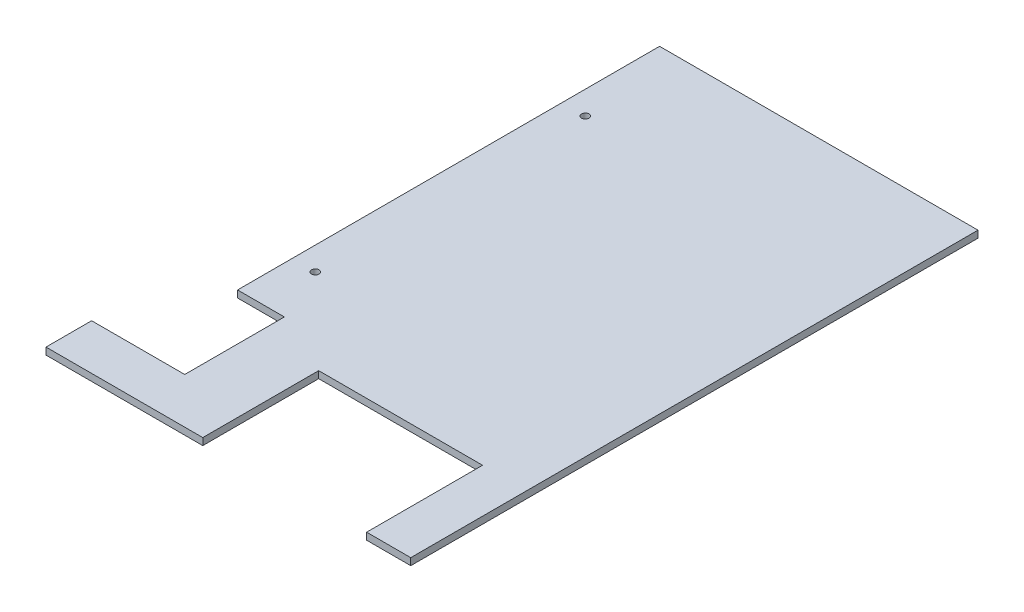
ISO-10303-21;
HEADER;
FILE_DESCRIPTION(('STEP AP214'),'2;1');
FILE_NAME('part.step','',(''),(''),'','','');
FILE_SCHEMA(('AUTOMOTIVE_DESIGN { 1 0 10303 214 1 1 1 1 }'));
ENDSEC;
DATA;
#1=APPLICATION_CONTEXT('core data for automotive mechanical design processes');
#2=APPLICATION_PROTOCOL_DEFINITION('international standard','automotive_design',2000,#1);
#3=PRODUCT_CONTEXT('',#1,'mechanical');
#4=PRODUCT('Part','Part','',(#3));
#5=PRODUCT_RELATED_PRODUCT_CATEGORY('part','',(#4));
#6=PRODUCT_DEFINITION_FORMATION('','',#4);
#7=PRODUCT_DEFINITION_CONTEXT('part definition',#1,'design');
#8=PRODUCT_DEFINITION('design','',#6,#7);
#9=PRODUCT_DEFINITION_SHAPE('','',#8);
#10=(LENGTH_UNIT() NAMED_UNIT(*) SI_UNIT(.MILLI.,.METRE.));
#11=(NAMED_UNIT(*) PLANE_ANGLE_UNIT() SI_UNIT($,.RADIAN.));
#12=(NAMED_UNIT(*) SI_UNIT($,.STERADIAN.) SOLID_ANGLE_UNIT());
#13=UNCERTAINTY_MEASURE_WITH_UNIT(LENGTH_MEASURE(1.E-05),#10,'distance_accuracy_value','');
#14=(GEOMETRIC_REPRESENTATION_CONTEXT(3) GLOBAL_UNCERTAINTY_ASSIGNED_CONTEXT((#13)) GLOBAL_UNIT_ASSIGNED_CONTEXT((#10,
#11,#12)) REPRESENTATION_CONTEXT('',''));
#15=CARTESIAN_POINT('',(0.,0.,0.));
#16=DIRECTION('',(0.,0.,1.));
#17=DIRECTION('',(1.,0.,0.));
#18=AXIS2_PLACEMENT_3D('',#15,#16,#17);
#19=CARTESIAN_POINT('',(-11.1108436136914,-564.298939869289,727.020141884642));
#20=DIRECTION('',(1.,0.,0.));
#21=DIRECTION('',(0.,1.,0.));
#22=AXIS2_PLACEMENT_3D('',#19,#20,#21);
#23=PLANE('',#22);
#24=DIRECTION('',(0.,-1.,0.));
#25=VECTOR('',#24,1.);
#26=CARTESIAN_POINT('',(-11.1108436136914,-564.298939869289,769.820141884645));
#27=LINE('',#26,#25);
#28=CARTESIAN_POINT('',(-11.1108436136914,-561.298939869289,769.820141884645));
#29=VERTEX_POINT('',#28);
#30=CARTESIAN_POINT('',(-11.1108436136914,-564.298939869289,769.820141884645));
#31=VERTEX_POINT('',#30);
#32=EDGE_CURVE('E272',#29,#31,#27,.T.);
#33=ORIENTED_EDGE('',*,*,#32,.F.);
#34=DIRECTION('',(0.,0.,-1.));
#35=VECTOR('',#34,1.);
#36=CARTESIAN_POINT('',(-11.1108436136914,-561.298939869289,727.020141884642));
#37=LINE('',#36,#35);
#38=CARTESIAN_POINT('',(-11.1108436136914,-561.298939869289,727.020141884642));
#39=VERTEX_POINT('',#38);
#40=EDGE_CURVE('E167',#29,#39,#37,.T.);
#41=ORIENTED_EDGE('',*,*,#40,.T.);
#42=DIRECTION('',(0.,1.,0.));
#43=VECTOR('',#42,1.);
#44=CARTESIAN_POINT('',(-11.1108436136914,-564.298939869289,727.020141884642));
#45=LINE('',#44,#43);
#46=CARTESIAN_POINT('',(-11.1108436136914,-564.298939869289,727.020141884642));
#47=VERTEX_POINT('',#46);
#48=EDGE_CURVE('E45',#47,#39,#45,.T.);
#49=ORIENTED_EDGE('',*,*,#48,.F.);
#50=DIRECTION('',(0.,0.,-1.));
#51=VECTOR('',#50,1.);
#52=CARTESIAN_POINT('',(-11.1108436136914,-564.298939869289,727.020141884642));
#53=LINE('',#52,#51);
#54=EDGE_CURVE('E243',#31,#47,#53,.T.);
#55=ORIENTED_EDGE('',*,*,#54,.F.);
#56=EDGE_LOOP('',(#33,#41,#49,#55));
#57=FACE_BOUND('',#56,.T.);
#58=ADVANCED_FACE('F36',(#57),#23,.F.);
#59=CARTESIAN_POINT('',(3.55975402391568E-12,-564.298939869289,0.));
#60=DIRECTION('',(0.,-1.,0.));
#61=DIRECTION('',(1.,0.,0.));
#62=AXIS2_PLACEMENT_3D('',#59,#60,#61);
#63=PLANE('',#62);
#64=CARTESIAN_POINT('',(-21.2108436137012,-564.298939869289,703.620141884642));
#65=DIRECTION('',(0.,-1.,0.));
#66=DIRECTION('',(1.,0.,0.));
#67=AXIS2_PLACEMENT_3D('',#64,#65,#66);
#68=CIRCLE('',#67,1.60000000000002);
#69=CARTESIAN_POINT('',(-19.6108436137012,-564.298939869289,703.620141884642));
#70=VERTEX_POINT('',#69);
#71=EDGE_CURVE('E163',#70,#70,#68,.T.);
#72=ORIENTED_EDGE('',*,*,#71,.F.);
#73=EDGE_LOOP('',(#72));
#74=FACE_BOUND('',#73,.T.);
#75=DIRECTION('',(0.,0.,1.));
#76=VECTOR('',#75,1.);
#77=CARTESIAN_POINT('',(16.2391563862961,-564.298939869289,789.420141884645));
#78=LINE('',#77,#76);
#79=CARTESIAN_POINT('',(16.2391563862961,-564.298939869289,739.620141884643));
#80=VERTEX_POINT('',#79);
#81=CARTESIAN_POINT('',(16.2391563862961,-564.298939869289,789.420141884645));
#82=VERTEX_POINT('',#81);
#83=EDGE_CURVE('E187',#80,#82,#78,.T.);
#84=ORIENTED_EDGE('',*,*,#83,.T.);
#85=DIRECTION('',(-1.,0.,0.));
#86=VECTOR('',#85,1.);
#87=CARTESIAN_POINT('',(-11.1108436136914,-564.298939869289,789.420141884645));
#88=LINE('',#87,#86);
#89=CARTESIAN_POINT('',(-51.1108436136914,-564.29893986929,789.420141884645));
#90=VERTEX_POINT('',#89);
#91=EDGE_CURVE('E104',#82,#90,#88,.T.);
#92=ORIENTED_EDGE('',*,*,#91,.T.);
#93=DIRECTION('',(0.,0.,1.));
#94=VECTOR('',#93,1.);
#95=CARTESIAN_POINT('',(-51.1108436136914,-564.29893986929,789.420141884645));
#96=LINE('',#95,#94);
#97=CARTESIAN_POINT('',(-51.1108436136914,-564.29893986929,769.820141884645));
#98=VERTEX_POINT('',#97);
#99=EDGE_CURVE('E271',#98,#90,#96,.T.);
#100=ORIENTED_EDGE('',*,*,#99,.F.);
#101=DIRECTION('',(1.,0.,0.));
#102=VECTOR('',#101,1.);
#103=CARTESIAN_POINT('',(-51.1108436136914,-564.29893986929,769.820141884645));
#104=LINE('',#103,#102);
#105=EDGE_CURVE('E52',#98,#31,#104,.T.);
#106=ORIENTED_EDGE('',*,*,#105,.T.);
#107=ORIENTED_EDGE('',*,*,#54,.T.);
#108=DIRECTION('',(-1.,0.,0.));
#109=VECTOR('',#108,1.);
#110=CARTESIAN_POINT('',(-31.2108436137012,-564.298939869289,727.020141884642));
#111=LINE('',#110,#109);
#112=CARTESIAN_POINT('',(-31.2108436137012,-564.298939869289,727.020141884642));
#113=VERTEX_POINT('',#112);
#114=EDGE_CURVE('E214',#47,#113,#111,.T.);
#115=ORIENTED_EDGE('',*,*,#114,.T.);
#116=DIRECTION('',(0.,0.,-1.));
#117=VECTOR('',#116,1.);
#118=CARTESIAN_POINT('',(-31.2108436137012,-564.298939869289,727.020141884642));
#119=LINE('',#118,#117);
#120=CARTESIAN_POINT('',(-31.2108436137011,-564.298939869289,545.720141884643));
#121=VERTEX_POINT('',#120);
#122=EDGE_CURVE('E235',#113,#121,#119,.T.);
#123=ORIENTED_EDGE('',*,*,#122,.T.);
#124=DIRECTION('',(1.,0.,0.));
#125=VECTOR('',#124,1.);
#126=CARTESIAN_POINT('',(-31.2108436137011,-564.298939869289,545.720141884643));
#127=LINE('',#126,#125);
#128=CARTESIAN_POINT('',(105.589156386298,-564.298939869289,545.720141884643));
#129=VERTEX_POINT('',#128);
#130=EDGE_CURVE('E234',#121,#129,#127,.T.);
#131=ORIENTED_EDGE('',*,*,#130,.T.);
#132=DIRECTION('',(0.,0.,1.));
#133=VECTOR('',#132,1.);
#134=CARTESIAN_POINT('',(105.589156386298,-564.298939869289,789.420141884645));
#135=LINE('',#134,#133);
#136=CARTESIAN_POINT('',(105.589156386298,-564.298939869289,789.420141884645));
#137=VERTEX_POINT('',#136);
#138=EDGE_CURVE('E131',#129,#137,#135,.T.);
#139=ORIENTED_EDGE('',*,*,#138,.T.);
#140=DIRECTION('',(-1.,0.,0.));
#141=VECTOR('',#140,1.);
#142=CARTESIAN_POINT('',(86.6391563862961,-564.298939869289,789.420141884645));
#143=LINE('',#142,#141);
#144=CARTESIAN_POINT('',(86.6391563862961,-564.298939869289,789.420141884645));
#145=VERTEX_POINT('',#144);
#146=EDGE_CURVE('E123',#137,#145,#143,.T.);
#147=ORIENTED_EDGE('',*,*,#146,.T.);
#148=DIRECTION('',(0.,0.,-1.));
#149=VECTOR('',#148,1.);
#150=CARTESIAN_POINT('',(86.6391563862961,-564.298939869289,789.420141884645));
#151=LINE('',#150,#149);
#152=CARTESIAN_POINT('',(86.639156386296,-564.298939869289,739.620141884643));
#153=VERTEX_POINT('',#152);
#154=EDGE_CURVE('E128',#145,#153,#151,.T.);
#155=ORIENTED_EDGE('',*,*,#154,.T.);
#156=DIRECTION('',(-1.,0.,0.));
#157=VECTOR('',#156,1.);
#158=CARTESIAN_POINT('',(16.2391563862961,-564.298939869289,739.620141884643));
#159=LINE('',#158,#157);
#160=EDGE_CURVE('E60',#153,#80,#159,.T.);
#161=ORIENTED_EDGE('',*,*,#160,.T.);
#162=EDGE_LOOP('',(#84,#92,#100,#106,#107,#115,#123,#131,#139,#147,#155,#161));
#163=FACE_BOUND('',#162,.T.);
#164=CARTESIAN_POINT('',(-21.2108436137,-564.298939869289,587.620141884642));
#165=DIRECTION('',(0.,-1.,0.));
#166=DIRECTION('',(1.,0.,0.));
#167=AXIS2_PLACEMENT_3D('',#164,#165,#166);
#168=CIRCLE('',#167,1.60000000000002);
#169=CARTESIAN_POINT('',(-19.6108436137,-564.298939869289,587.620141884642));
#170=VERTEX_POINT('',#169);
#171=EDGE_CURVE('E254',#170,#170,#168,.T.);
#172=ORIENTED_EDGE('',*,*,#171,.F.);
#173=EDGE_LOOP('',(#172));
#174=FACE_BOUND('',#173,.T.);
#175=ADVANCED_FACE('F125',(#74,#163,#174),#63,.T.);
#176=CARTESIAN_POINT('',(3.54072162920782E-12,-561.298939869289,0.));
#177=DIRECTION('',(0.,-1.,0.));
#178=DIRECTION('',(1.,0.,0.));
#179=AXIS2_PLACEMENT_3D('',#176,#177,#178);
#180=PLANE('',#179);
#181=DIRECTION('',(0.,0.,1.));
#182=VECTOR('',#181,1.);
#183=CARTESIAN_POINT('',(16.239156386296,-561.298939869289,789.420141884645));
#184=LINE('',#183,#182);
#185=CARTESIAN_POINT('',(16.239156386296,-561.298939869289,739.620141884643));
#186=VERTEX_POINT('',#185);
#187=CARTESIAN_POINT('',(16.239156386296,-561.298939869289,789.420141884645));
#188=VERTEX_POINT('',#187);
#189=EDGE_CURVE('E158',#186,#188,#184,.T.);
#190=ORIENTED_EDGE('',*,*,#189,.F.);
#191=DIRECTION('',(-1.,0.,0.));
#192=VECTOR('',#191,1.);
#193=CARTESIAN_POINT('',(16.239156386296,-561.298939869289,739.620141884643));
#194=LINE('',#193,#192);
#195=CARTESIAN_POINT('',(86.639156386296,-561.298939869289,739.620141884643));
#196=VERTEX_POINT('',#195);
#197=EDGE_CURVE('E96',#196,#186,#194,.T.);
#198=ORIENTED_EDGE('',*,*,#197,.F.);
#199=DIRECTION('',(0.,0.,-1.));
#200=VECTOR('',#199,1.);
#201=CARTESIAN_POINT('',(86.639156386296,-561.298939869289,789.420141884645));
#202=LINE('',#201,#200);
#203=CARTESIAN_POINT('',(86.639156386296,-561.298939869289,789.420141884645));
#204=VERTEX_POINT('',#203);
#205=EDGE_CURVE('E183',#204,#196,#202,.T.);
#206=ORIENTED_EDGE('',*,*,#205,.F.);
#207=DIRECTION('',(-1.,0.,0.));
#208=VECTOR('',#207,1.);
#209=CARTESIAN_POINT('',(86.639156386296,-561.298939869289,789.420141884645));
#210=LINE('',#209,#208);
#211=CARTESIAN_POINT('',(105.589156386298,-561.298939869289,789.420141884645));
#212=VERTEX_POINT('',#211);
#213=EDGE_CURVE('E141',#212,#204,#210,.T.);
#214=ORIENTED_EDGE('',*,*,#213,.F.);
#215=DIRECTION('',(0.,0.,1.));
#216=VECTOR('',#215,1.);
#217=CARTESIAN_POINT('',(105.589156386298,-561.298939869289,789.420141884645));
#218=LINE('',#217,#216);
#219=CARTESIAN_POINT('',(105.589156386298,-561.298939869289,545.720141884643));
#220=VERTEX_POINT('',#219);
#221=EDGE_CURVE('E178',#220,#212,#218,.T.);
#222=ORIENTED_EDGE('',*,*,#221,.F.);
#223=DIRECTION('',(1.,0.,0.));
#224=VECTOR('',#223,1.);
#225=CARTESIAN_POINT('',(-31.2108436137012,-561.298939869289,545.720141884643));
#226=LINE('',#225,#224);
#227=CARTESIAN_POINT('',(-31.2108436137012,-561.298939869289,545.720141884643));
#228=VERTEX_POINT('',#227);
#229=EDGE_CURVE('E175',#228,#220,#226,.T.);
#230=ORIENTED_EDGE('',*,*,#229,.F.);
#231=DIRECTION('',(0.,0.,-1.));
#232=VECTOR('',#231,1.);
#233=CARTESIAN_POINT('',(-31.2108436137012,-561.298939869289,727.020141884642));
#234=LINE('',#233,#232);
#235=CARTESIAN_POINT('',(-31.2108436137012,-561.298939869289,727.020141884642));
#236=VERTEX_POINT('',#235);
#237=EDGE_CURVE('E172',#236,#228,#234,.T.);
#238=ORIENTED_EDGE('',*,*,#237,.F.);
#239=DIRECTION('',(-1.,0.,0.));
#240=VECTOR('',#239,1.);
#241=CARTESIAN_POINT('',(-31.2108436137012,-561.298939869289,727.020141884642));
#242=LINE('',#241,#240);
#243=EDGE_CURVE('E169',#39,#236,#242,.T.);
#244=ORIENTED_EDGE('',*,*,#243,.F.);
#245=ORIENTED_EDGE('',*,*,#40,.F.);
#246=DIRECTION('',(1.,0.,0.));
#247=VECTOR('',#246,1.);
#248=CARTESIAN_POINT('',(-51.1108436136914,-561.29893986929,769.820141884645));
#249=LINE('',#248,#247);
#250=CARTESIAN_POINT('',(-51.1108436136914,-561.29893986929,769.820141884645));
#251=VERTEX_POINT('',#250);
#252=EDGE_CURVE('E262',#251,#29,#249,.T.);
#253=ORIENTED_EDGE('',*,*,#252,.F.);
#254=DIRECTION('',(0.,0.,-1.));
#255=VECTOR('',#254,1.);
#256=CARTESIAN_POINT('',(-51.1108436136914,-561.29893986929,789.420141884645));
#257=LINE('',#256,#255);
#258=CARTESIAN_POINT('',(-51.1108436136914,-561.29893986929,789.420141884645));
#259=VERTEX_POINT('',#258);
#260=EDGE_CURVE('E283',#259,#251,#257,.T.);
#261=ORIENTED_EDGE('',*,*,#260,.F.);
#262=DIRECTION('',(-1.,0.,0.));
#263=VECTOR('',#262,1.);
#264=CARTESIAN_POINT('',(-11.1108436136914,-561.298939869289,789.420141884645));
#265=LINE('',#264,#263);
#266=EDGE_CURVE('E162',#188,#259,#265,.T.);
#267=ORIENTED_EDGE('',*,*,#266,.F.);
#268=EDGE_LOOP('',(#190,#198,#206,#214,#222,#230,#238,#244,#245,#253,#261,#267));
#269=FACE_BOUND('',#268,.T.);
#270=CARTESIAN_POINT('',(-21.2108436137012,-561.298939869289,703.620141884642));
#271=DIRECTION('',(0.,-1.,0.));
#272=DIRECTION('',(1.,0.,0.));
#273=AXIS2_PLACEMENT_3D('',#270,#271,#272);
#274=CIRCLE('',#273,1.60000000000002);
#275=CARTESIAN_POINT('',(-19.6108436137012,-561.298939869289,703.620141884642));
#276=VERTEX_POINT('',#275);
#277=EDGE_CURVE('E250',#276,#276,#274,.T.);
#278=ORIENTED_EDGE('',*,*,#277,.T.);
#279=EDGE_LOOP('',(#278));
#280=FACE_BOUND('',#279,.T.);
#281=CARTESIAN_POINT('',(-21.2108436137,-561.298939869289,587.620141884642));
#282=DIRECTION('',(0.,-1.,0.));
#283=DIRECTION('',(1.,0.,0.));
#284=AXIS2_PLACEMENT_3D('',#281,#282,#283);
#285=CIRCLE('',#284,1.60000000000002);
#286=CARTESIAN_POINT('',(-19.6108436137,-561.298939869289,587.620141884642));
#287=VERTEX_POINT('',#286);
#288=EDGE_CURVE('E258',#287,#287,#285,.T.);
#289=ORIENTED_EDGE('',*,*,#288,.T.);
#290=EDGE_LOOP('',(#289));
#291=FACE_BOUND('',#290,.T.);
#292=ADVANCED_FACE('F221',(#269,#280,#291),#180,.F.);
#293=CARTESIAN_POINT('',(16.2391563862961,-564.298939869289,789.420141884645));
#294=DIRECTION('',(-1.,0.,0.));
#295=DIRECTION('',(0.,-1.,0.));
#296=AXIS2_PLACEMENT_3D('',#293,#294,#295);
#297=PLANE('',#296);
#298=ORIENTED_EDGE('',*,*,#189,.T.);
#299=DIRECTION('',(0.,1.,0.));
#300=VECTOR('',#299,1.);
#301=CARTESIAN_POINT('',(16.2391563862961,-564.298939869289,789.420141884645));
#302=LINE('',#301,#300);
#303=EDGE_CURVE('E11',#82,#188,#302,.T.);
#304=ORIENTED_EDGE('',*,*,#303,.F.);
#305=ORIENTED_EDGE('',*,*,#83,.F.);
#306=DIRECTION('',(0.,1.,0.));
#307=VECTOR('',#306,1.);
#308=CARTESIAN_POINT('',(16.2391563862961,-564.298939869289,739.620141884643));
#309=LINE('',#308,#307);
#310=EDGE_CURVE('E154',#80,#186,#309,.T.);
#311=ORIENTED_EDGE('',*,*,#310,.T.);
#312=EDGE_LOOP('',(#298,#304,#305,#311));
#313=FACE_BOUND('',#312,.T.);
#314=ADVANCED_FACE('F38',(#313),#297,.F.);
#315=CARTESIAN_POINT('',(-11.1108436136914,-564.298939869289,789.420141884645));
#316=DIRECTION('',(0.,0.,-1.));
#317=DIRECTION('',(-1.,0.,0.));
#318=AXIS2_PLACEMENT_3D('',#315,#316,#317);
#319=PLANE('',#318);
#320=ORIENTED_EDGE('',*,*,#266,.T.);
#321=DIRECTION('',(0.,1.,0.));
#322=VECTOR('',#321,1.);
#323=CARTESIAN_POINT('',(-51.1108436136914,-564.29893986929,789.420141884645));
#324=LINE('',#323,#322);
#325=EDGE_CURVE('E275',#90,#259,#324,.T.);
#326=ORIENTED_EDGE('',*,*,#325,.F.);
#327=ORIENTED_EDGE('',*,*,#91,.F.);
#328=ORIENTED_EDGE('',*,*,#303,.T.);
#329=EDGE_LOOP('',(#320,#326,#327,#328));
#330=FACE_BOUND('',#329,.T.);
#331=ADVANCED_FACE('F295',(#330),#319,.F.);
#332=CARTESIAN_POINT('',(-31.2108436137012,-564.298939869289,727.020141884642));
#333=DIRECTION('',(0.,0.,-1.));
#334=DIRECTION('',(-1.,0.,0.));
#335=AXIS2_PLACEMENT_3D('',#332,#333,#334);
#336=PLANE('',#335);
#337=ORIENTED_EDGE('',*,*,#243,.T.);
#338=DIRECTION('',(0.,1.,0.));
#339=VECTOR('',#338,1.);
#340=CARTESIAN_POINT('',(-31.2108436137012,-564.298939869289,727.020141884642));
#341=LINE('',#340,#339);
#342=EDGE_CURVE('E202',#113,#236,#341,.T.);
#343=ORIENTED_EDGE('',*,*,#342,.F.);
#344=ORIENTED_EDGE('',*,*,#114,.F.);
#345=ORIENTED_EDGE('',*,*,#48,.T.);
#346=EDGE_LOOP('',(#337,#343,#344,#345));
#347=FACE_BOUND('',#346,.T.);
#348=ADVANCED_FACE('F212',(#347),#336,.F.);
#349=CARTESIAN_POINT('',(-31.2108436137012,-564.298939869289,727.020141884642));
#350=DIRECTION('',(1.,0.,0.));
#351=DIRECTION('',(0.,1.,0.));
#352=AXIS2_PLACEMENT_3D('',#349,#350,#351);
#353=PLANE('',#352);
#354=ORIENTED_EDGE('',*,*,#237,.T.);
#355=DIRECTION('',(0.,1.,0.));
#356=VECTOR('',#355,1.);
#357=CARTESIAN_POINT('',(-31.2108436137011,-564.298939869289,545.720141884643));
#358=LINE('',#357,#356);
#359=EDGE_CURVE('E198',#121,#228,#358,.T.);
#360=ORIENTED_EDGE('',*,*,#359,.F.);
#361=ORIENTED_EDGE('',*,*,#122,.F.);
#362=ORIENTED_EDGE('',*,*,#342,.T.);
#363=EDGE_LOOP('',(#354,#360,#361,#362));
#364=FACE_BOUND('',#363,.T.);
#365=ADVANCED_FACE('F228',(#364),#353,.F.);
#366=CARTESIAN_POINT('',(-31.2108436137011,-564.298939869289,545.720141884643));
#367=DIRECTION('',(0.,0.,1.));
#368=DIRECTION('',(1.,0.,0.));
#369=AXIS2_PLACEMENT_3D('',#366,#367,#368);
#370=PLANE('',#369);
#371=ORIENTED_EDGE('',*,*,#229,.T.);
#372=DIRECTION('',(0.,1.,0.));
#373=VECTOR('',#372,1.);
#374=CARTESIAN_POINT('',(105.589156386298,-564.298939869289,545.720141884643));
#375=LINE('',#374,#373);
#376=EDGE_CURVE('E194',#129,#220,#375,.T.);
#377=ORIENTED_EDGE('',*,*,#376,.F.);
#378=ORIENTED_EDGE('',*,*,#130,.F.);
#379=ORIENTED_EDGE('',*,*,#359,.T.);
#380=EDGE_LOOP('',(#371,#377,#378,#379));
#381=FACE_BOUND('',#380,.T.);
#382=ADVANCED_FACE('F232',(#381),#370,.F.);
#383=CARTESIAN_POINT('',(105.589156386298,-564.298939869289,789.420141884645));
#384=DIRECTION('',(-1.,0.,0.));
#385=DIRECTION('',(0.,-1.,0.));
#386=AXIS2_PLACEMENT_3D('',#383,#384,#385);
#387=PLANE('',#386);
#388=ORIENTED_EDGE('',*,*,#221,.T.);
#389=DIRECTION('',(0.,1.,0.));
#390=VECTOR('',#389,1.);
#391=CARTESIAN_POINT('',(105.589156386298,-564.298939869289,789.420141884645));
#392=LINE('',#391,#390);
#393=EDGE_CURVE('E145',#137,#212,#392,.T.);
#394=ORIENTED_EDGE('',*,*,#393,.F.);
#395=ORIENTED_EDGE('',*,*,#138,.F.);
#396=ORIENTED_EDGE('',*,*,#376,.T.);
#397=EDGE_LOOP('',(#388,#394,#395,#396));
#398=FACE_BOUND('',#397,.T.);
#399=ADVANCED_FACE('F339',(#398),#387,.F.);
#400=CARTESIAN_POINT('',(86.6391563862961,-564.298939869289,789.420141884645));
#401=DIRECTION('',(0.,0.,-1.));
#402=DIRECTION('',(-1.,0.,0.));
#403=AXIS2_PLACEMENT_3D('',#400,#401,#402);
#404=PLANE('',#403);
#405=ORIENTED_EDGE('',*,*,#213,.T.);
#406=DIRECTION('',(0.,1.,0.));
#407=VECTOR('',#406,1.);
#408=CARTESIAN_POINT('',(86.6391563862961,-564.298939869289,789.420141884645));
#409=LINE('',#408,#407);
#410=EDGE_CURVE('E138',#145,#204,#409,.T.);
#411=ORIENTED_EDGE('',*,*,#410,.F.);
#412=ORIENTED_EDGE('',*,*,#146,.F.);
#413=ORIENTED_EDGE('',*,*,#393,.T.);
#414=EDGE_LOOP('',(#405,#411,#412,#413));
#415=FACE_BOUND('',#414,.T.);
#416=ADVANCED_FACE('F139',(#415),#404,.F.);
#417=CARTESIAN_POINT('',(86.6391563862961,-564.298939869289,789.420141884645));
#418=DIRECTION('',(1.,0.,0.));
#419=DIRECTION('',(0.,1.,0.));
#420=AXIS2_PLACEMENT_3D('',#417,#418,#419);
#421=PLANE('',#420);
#422=ORIENTED_EDGE('',*,*,#205,.T.);
#423=DIRECTION('',(0.,1.,0.));
#424=VECTOR('',#423,1.);
#425=CARTESIAN_POINT('',(86.639156386296,-564.298939869289,739.620141884643));
#426=LINE('',#425,#424);
#427=EDGE_CURVE('E146',#153,#196,#426,.T.);
#428=ORIENTED_EDGE('',*,*,#427,.F.);
#429=ORIENTED_EDGE('',*,*,#154,.F.);
#430=ORIENTED_EDGE('',*,*,#410,.T.);
#431=EDGE_LOOP('',(#422,#428,#429,#430));
#432=FACE_BOUND('',#431,.T.);
#433=ADVANCED_FACE('F148',(#432),#421,.F.);
#434=CARTESIAN_POINT('',(16.2391563862961,-564.298939869289,739.620141884643));
#435=DIRECTION('',(0.,0.,-1.));
#436=DIRECTION('',(-1.,0.,0.));
#437=AXIS2_PLACEMENT_3D('',#434,#435,#436);
#438=PLANE('',#437);
#439=ORIENTED_EDGE('',*,*,#197,.T.);
#440=ORIENTED_EDGE('',*,*,#310,.F.);
#441=ORIENTED_EDGE('',*,*,#160,.F.);
#442=ORIENTED_EDGE('',*,*,#427,.T.);
#443=EDGE_LOOP('',(#439,#440,#441,#442));
#444=FACE_BOUND('',#443,.T.);
#445=ADVANCED_FACE('F324',(#444),#438,.F.);
#446=CARTESIAN_POINT('',(-21.2108436137012,-564.298939869289,703.620141884642));
#447=DIRECTION('',(0.,1.,0.));
#448=DIRECTION('',(-1.,0.,0.));
#449=AXIS2_PLACEMENT_3D('',#446,#447,#448);
#450=CYLINDRICAL_SURFACE('',#449,1.60000000000002);
#451=ORIENTED_EDGE('',*,*,#71,.T.);
#452=EDGE_LOOP('',(#451));
#453=FACE_BOUND('',#452,.T.);
#454=ORIENTED_EDGE('',*,*,#277,.F.);
#455=EDGE_LOOP('',(#454));
#456=FACE_BOUND('',#455,.T.);
#457=ADVANCED_FACE('F326',(#453,#456),#450,.F.);
#458=CARTESIAN_POINT('',(-21.2108436137,-564.298939869289,587.620141884642));
#459=DIRECTION('',(0.,1.,0.));
#460=DIRECTION('',(-1.,0.,0.));
#461=AXIS2_PLACEMENT_3D('',#458,#459,#460);
#462=CYLINDRICAL_SURFACE('',#461,1.60000000000002);
#463=ORIENTED_EDGE('',*,*,#171,.T.);
#464=EDGE_LOOP('',(#463));
#465=FACE_BOUND('',#464,.T.);
#466=ORIENTED_EDGE('',*,*,#288,.F.);
#467=EDGE_LOOP('',(#466));
#468=FACE_BOUND('',#467,.T.);
#469=ADVANCED_FACE('F332',(#465,#468),#462,.F.);
#470=CARTESIAN_POINT('',(-51.1108436136914,-564.29893986929,769.820141884645));
#471=DIRECTION('',(0.,0.,1.));
#472=DIRECTION('',(1.,0.,0.));
#473=AXIS2_PLACEMENT_3D('',#470,#471,#472);
#474=PLANE('',#473);
#475=ORIENTED_EDGE('',*,*,#32,.T.);
#476=ORIENTED_EDGE('',*,*,#105,.F.);
#477=DIRECTION('',(0.,-1.,0.));
#478=VECTOR('',#477,1.);
#479=CARTESIAN_POINT('',(-51.1108436136914,-564.29893986929,769.820141884645));
#480=LINE('',#479,#478);
#481=EDGE_CURVE('E279',#251,#98,#480,.T.);
#482=ORIENTED_EDGE('',*,*,#481,.F.);
#483=ORIENTED_EDGE('',*,*,#252,.T.);
#484=EDGE_LOOP('',(#475,#476,#482,#483));
#485=FACE_BOUND('',#484,.T.);
#486=ADVANCED_FACE('F301',(#485),#474,.F.);
#487=CARTESIAN_POINT('',(-51.110843613695,-3.24437480704939E-13,0.));
#488=DIRECTION('',(-1.,0.,0.));
#489=DIRECTION('',(0.,-1.,0.));
#490=AXIS2_PLACEMENT_3D('',#487,#488,#489);
#491=PLANE('',#490);
#492=ORIENTED_EDGE('',*,*,#325,.T.);
#493=ORIENTED_EDGE('',*,*,#260,.T.);
#494=ORIENTED_EDGE('',*,*,#481,.T.);
#495=ORIENTED_EDGE('',*,*,#99,.T.);
#496=EDGE_LOOP('',(#492,#493,#494,#495));
#497=FACE_BOUND('',#496,.T.);
#498=ADVANCED_FACE('F291',(#497),#491,.T.);
#499=CLOSED_SHELL('',(#58,#175,#292,#314,#331,#348,#365,#382,#399,#416,#433,#445,#457,#469,#486,#498));
#500=MANIFOLD_SOLID_BREP('B2',#499);
#501=ADVANCED_BREP_SHAPE_REPRESENTATION('',(#18,#500),#14);
#502=SHAPE_DEFINITION_REPRESENTATION(#9,#501);
ENDSEC;
END-ISO-10303-21;
